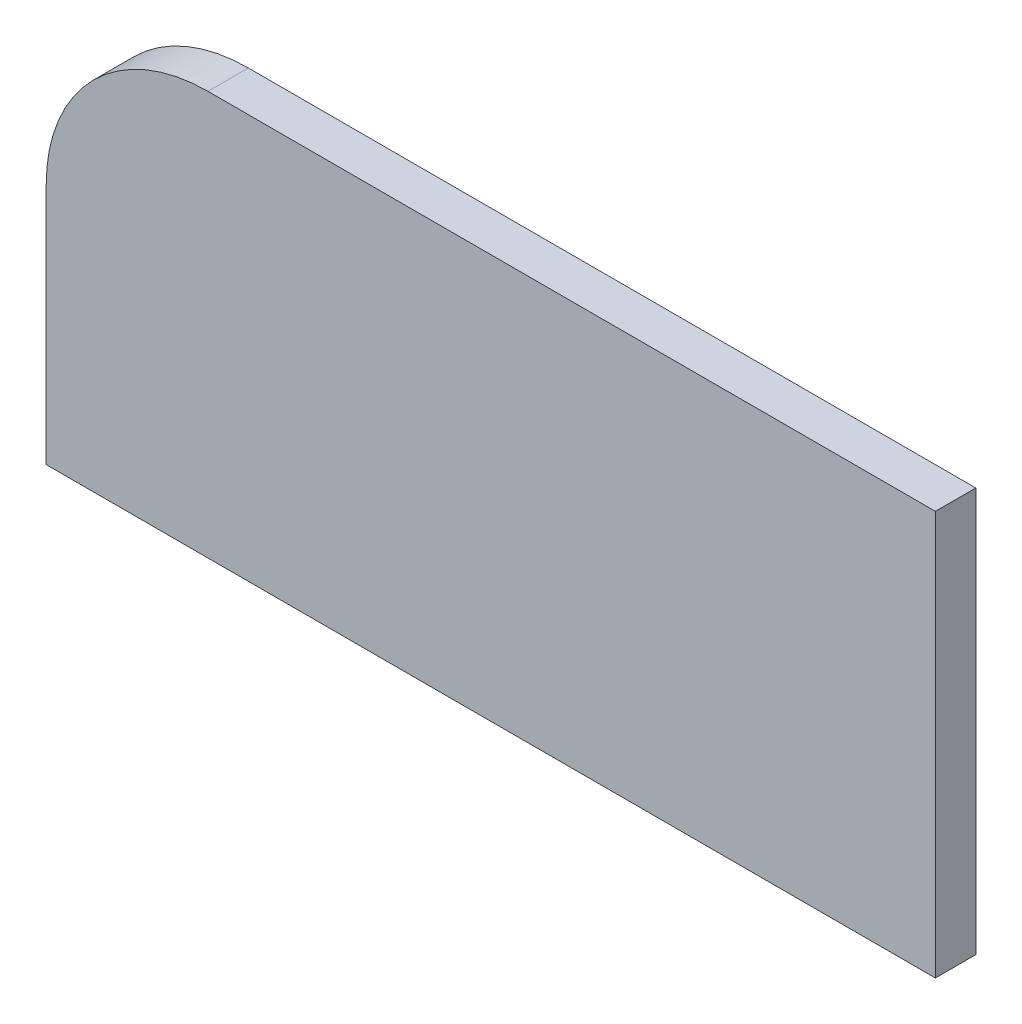
ISO-10303-21;
HEADER;
FILE_DESCRIPTION(('STEP AP214'),'2;1');
FILE_NAME('part.step','',(''),(''),'','','');
FILE_SCHEMA(('AUTOMOTIVE_DESIGN { 1 0 10303 214 1 1 1 1 }'));
ENDSEC;
DATA;
#1=APPLICATION_CONTEXT('core data for automotive mechanical design processes');
#2=APPLICATION_PROTOCOL_DEFINITION('international standard','automotive_design',2000,#1);
#3=PRODUCT_CONTEXT('',#1,'mechanical');
#4=PRODUCT('Part','Part','',(#3));
#5=PRODUCT_RELATED_PRODUCT_CATEGORY('part','',(#4));
#6=PRODUCT_DEFINITION_FORMATION('','',#4);
#7=PRODUCT_DEFINITION_CONTEXT('part definition',#1,'design');
#8=PRODUCT_DEFINITION('design','',#6,#7);
#9=PRODUCT_DEFINITION_SHAPE('','',#8);
#10=(LENGTH_UNIT() NAMED_UNIT(*) SI_UNIT(.MILLI.,.METRE.));
#11=(NAMED_UNIT(*) PLANE_ANGLE_UNIT() SI_UNIT($,.RADIAN.));
#12=(NAMED_UNIT(*) SI_UNIT($,.STERADIAN.) SOLID_ANGLE_UNIT());
#13=UNCERTAINTY_MEASURE_WITH_UNIT(LENGTH_MEASURE(1.E-05),#10,'distance_accuracy_value','');
#14=(GEOMETRIC_REPRESENTATION_CONTEXT(3) GLOBAL_UNCERTAINTY_ASSIGNED_CONTEXT((#13)) GLOBAL_UNIT_ASSIGNED_CONTEXT((#10,
#11,#12)) REPRESENTATION_CONTEXT('',''));
#15=CARTESIAN_POINT('',(0.,0.,0.));
#16=DIRECTION('',(0.,0.,1.));
#17=DIRECTION('',(1.,0.,0.));
#18=AXIS2_PLACEMENT_3D('',#15,#16,#17);
#19=CARTESIAN_POINT('',(0.,0.,5.));
#20=DIRECTION('',(1.,0.,0.));
#21=DIRECTION('',(0.,0.,-1.));
#22=AXIS2_PLACEMENT_3D('',#19,#20,#21);
#23=PLANE('',#22);
#24=DIRECTION('',(0.,-1.,0.));
#25=VECTOR('',#24,1.);
#26=CARTESIAN_POINT('',(0.,0.,5.));
#27=LINE('',#26,#25);
#28=CARTESIAN_POINT('',(0.,30.,5.));
#29=VERTEX_POINT('',#28);
#30=CARTESIAN_POINT('',(0.,0.,5.));
#31=VERTEX_POINT('',#30);
#32=EDGE_CURVE('E77',#29,#31,#27,.T.);
#33=ORIENTED_EDGE('',*,*,#32,.F.);
#34=DIRECTION('',(0.,0.,-1.));
#35=VECTOR('',#34,1.);
#36=CARTESIAN_POINT('',(0.,30.,5.));
#37=LINE('',#36,#35);
#38=CARTESIAN_POINT('',(0.,30.,0.));
#39=VERTEX_POINT('',#38);
#40=EDGE_CURVE('E100',#29,#39,#37,.T.);
#41=ORIENTED_EDGE('',*,*,#40,.T.);
#42=DIRECTION('',(0.,-1.,0.));
#43=VECTOR('',#42,1.);
#44=CARTESIAN_POINT('',(0.,0.,0.));
#45=LINE('',#44,#43);
#46=CARTESIAN_POINT('',(0.,0.,0.));
#47=VERTEX_POINT('',#46);
#48=EDGE_CURVE('E98',#39,#47,#45,.T.);
#49=ORIENTED_EDGE('',*,*,#48,.T.);
#50=DIRECTION('',(0.,0.,-1.));
#51=VECTOR('',#50,1.);
#52=CARTESIAN_POINT('',(0.,0.,5.));
#53=LINE('',#52,#51);
#54=EDGE_CURVE('E92',#31,#47,#53,.T.);
#55=ORIENTED_EDGE('',*,*,#54,.F.);
#56=EDGE_LOOP('',(#33,#41,#49,#55));
#57=FACE_BOUND('',#56,.T.);
#58=ADVANCED_FACE('F31',(#57),#23,.F.);
#59=CARTESIAN_POINT('',(0.,0.,5.));
#60=DIRECTION('',(0.,1.,0.));
#61=DIRECTION('',(0.,0.,1.));
#62=AXIS2_PLACEMENT_3D('',#59,#60,#61);
#63=PLANE('',#62);
#64=DIRECTION('',(1.,0.,0.));
#65=VECTOR('',#64,1.);
#66=CARTESIAN_POINT('',(0.,0.,0.));
#67=LINE('',#66,#65);
#68=CARTESIAN_POINT('',(110.,0.,0.));
#69=VERTEX_POINT('',#68);
#70=EDGE_CURVE('E113',#47,#69,#67,.T.);
#71=ORIENTED_EDGE('',*,*,#70,.T.);
#72=DIRECTION('',(0.,0.,-1.));
#73=VECTOR('',#72,1.);
#74=CARTESIAN_POINT('',(110.,0.,5.));
#75=LINE('',#74,#73);
#76=CARTESIAN_POINT('',(110.,0.,5.));
#77=VERTEX_POINT('',#76);
#78=EDGE_CURVE('E94',#77,#69,#75,.T.);
#79=ORIENTED_EDGE('',*,*,#78,.F.);
#80=DIRECTION('',(1.,0.,0.));
#81=VECTOR('',#80,1.);
#82=CARTESIAN_POINT('',(0.,0.,5.));
#83=LINE('',#82,#81);
#84=EDGE_CURVE('E80',#31,#77,#83,.T.);
#85=ORIENTED_EDGE('',*,*,#84,.F.);
#86=ORIENTED_EDGE('',*,*,#54,.T.);
#87=EDGE_LOOP('',(#71,#79,#85,#86));
#88=FACE_BOUND('',#87,.T.);
#89=ADVANCED_FACE('F91',(#88),#63,.F.);
#90=CARTESIAN_POINT('',(110.,0.,5.));
#91=DIRECTION('',(-1.,0.,0.));
#92=DIRECTION('',(0.,0.,1.));
#93=AXIS2_PLACEMENT_3D('',#90,#91,#92);
#94=PLANE('',#93);
#95=DIRECTION('',(0.,1.,0.));
#96=VECTOR('',#95,1.);
#97=CARTESIAN_POINT('',(110.,0.,0.));
#98=LINE('',#97,#96);
#99=CARTESIAN_POINT('',(110.,50.,0.));
#100=VERTEX_POINT('',#99);
#101=EDGE_CURVE('E111',#69,#100,#98,.T.);
#102=ORIENTED_EDGE('',*,*,#101,.T.);
#103=DIRECTION('',(0.,0.,-1.));
#104=VECTOR('',#103,1.);
#105=CARTESIAN_POINT('',(110.,50.,5.));
#106=LINE('',#105,#104);
#107=CARTESIAN_POINT('',(110.,50.,5.));
#108=VERTEX_POINT('',#107);
#109=EDGE_CURVE('E103',#108,#100,#106,.T.);
#110=ORIENTED_EDGE('',*,*,#109,.F.);
#111=DIRECTION('',(0.,1.,0.));
#112=VECTOR('',#111,1.);
#113=CARTESIAN_POINT('',(110.,0.,5.));
#114=LINE('',#113,#112);
#115=EDGE_CURVE('E96',#77,#108,#114,.T.);
#116=ORIENTED_EDGE('',*,*,#115,.F.);
#117=ORIENTED_EDGE('',*,*,#78,.T.);
#118=EDGE_LOOP('',(#102,#110,#116,#117));
#119=FACE_BOUND('',#118,.T.);
#120=ADVANCED_FACE('F119',(#119),#94,.F.);
#121=CARTESIAN_POINT('',(0.,50.,5.));
#122=DIRECTION('',(0.,-1.,0.));
#123=DIRECTION('',(0.,0.,-1.));
#124=AXIS2_PLACEMENT_3D('',#121,#122,#123);
#125=PLANE('',#124);
#126=DIRECTION('',(-1.,0.,0.));
#127=VECTOR('',#126,1.);
#128=CARTESIAN_POINT('',(0.,50.,0.));
#129=LINE('',#128,#127);
#130=CARTESIAN_POINT('',(20.,50.,0.));
#131=VERTEX_POINT('',#130);
#132=EDGE_CURVE('E87',#100,#131,#129,.T.);
#133=ORIENTED_EDGE('',*,*,#132,.T.);
#134=DIRECTION('',(0.,0.,-1.));
#135=VECTOR('',#134,1.);
#136=CARTESIAN_POINT('',(20.,50.,5.));
#137=LINE('',#136,#135);
#138=CARTESIAN_POINT('',(20.,50.,5.));
#139=VERTEX_POINT('',#138);
#140=EDGE_CURVE('E39',#131,#139,#137,.F.);
#141=ORIENTED_EDGE('',*,*,#140,.T.);
#142=DIRECTION('',(-1.,0.,0.));
#143=VECTOR('',#142,1.);
#144=CARTESIAN_POINT('',(0.,50.,5.));
#145=LINE('',#144,#143);
#146=EDGE_CURVE('E109',#108,#139,#145,.T.);
#147=ORIENTED_EDGE('',*,*,#146,.F.);
#148=ORIENTED_EDGE('',*,*,#109,.T.);
#149=EDGE_LOOP('',(#133,#141,#147,#148));
#150=FACE_BOUND('',#149,.T.);
#151=ADVANCED_FACE('F121',(#150),#125,.F.);
#152=CARTESIAN_POINT('',(0.,50.,5.));
#153=DIRECTION('',(0.,0.,-1.));
#154=DIRECTION('',(-1.,0.,0.));
#155=AXIS2_PLACEMENT_3D('',#152,#153,#154);
#156=PLANE('',#155);
#157=ORIENTED_EDGE('',*,*,#146,.T.);
#158=CARTESIAN_POINT('',(20.,30.,5.));
#159=DIRECTION('',(0.,0.,-1.));
#160=DIRECTION('',(-1.,0.,0.));
#161=AXIS2_PLACEMENT_3D('',#158,#159,#160);
#162=CIRCLE('',#161,20.);
#163=EDGE_CURVE('E11',#139,#29,#162,.F.);
#164=ORIENTED_EDGE('',*,*,#163,.T.);
#165=ORIENTED_EDGE('',*,*,#32,.T.);
#166=ORIENTED_EDGE('',*,*,#84,.T.);
#167=ORIENTED_EDGE('',*,*,#115,.T.);
#168=EDGE_LOOP('',(#157,#164,#165,#166,#167));
#169=FACE_BOUND('',#168,.T.);
#170=ADVANCED_FACE('F79',(#169),#156,.F.);
#171=CARTESIAN_POINT('',(0.,50.,0.));
#172=DIRECTION('',(0.,0.,-1.));
#173=DIRECTION('',(-1.,0.,0.));
#174=AXIS2_PLACEMENT_3D('',#171,#172,#173);
#175=PLANE('',#174);
#176=ORIENTED_EDGE('',*,*,#48,.F.);
#177=CARTESIAN_POINT('',(20.,30.,0.));
#178=DIRECTION('',(0.,0.,-1.));
#179=DIRECTION('',(-1.,0.,0.));
#180=AXIS2_PLACEMENT_3D('',#177,#178,#179);
#181=CIRCLE('',#180,20.);
#182=EDGE_CURVE('E53',#39,#131,#181,.T.);
#183=ORIENTED_EDGE('',*,*,#182,.T.);
#184=ORIENTED_EDGE('',*,*,#132,.F.);
#185=ORIENTED_EDGE('',*,*,#101,.F.);
#186=ORIENTED_EDGE('',*,*,#70,.F.);
#187=EDGE_LOOP('',(#176,#183,#184,#185,#186));
#188=FACE_BOUND('',#187,.T.);
#189=ADVANCED_FACE('F128',(#188),#175,.T.);
#190=CARTESIAN_POINT('',(20.,30.,5.));
#191=DIRECTION('',(0.,0.,-1.));
#192=DIRECTION('',(-1.,0.,0.));
#193=AXIS2_PLACEMENT_3D('',#190,#191,#192);
#194=CYLINDRICAL_SURFACE('',#193,20.);
#195=ORIENTED_EDGE('',*,*,#163,.F.);
#196=ORIENTED_EDGE('',*,*,#140,.F.);
#197=ORIENTED_EDGE('',*,*,#182,.F.);
#198=ORIENTED_EDGE('',*,*,#40,.F.);
#199=EDGE_LOOP('',(#195,#196,#197,#198));
#200=FACE_BOUND('',#199,.T.);
#201=ADVANCED_FACE('F33',(#200),#194,.T.);
#202=CLOSED_SHELL('',(#58,#89,#120,#151,#170,#189,#201));
#203=MANIFOLD_SOLID_BREP('B2',#202);
#204=ADVANCED_BREP_SHAPE_REPRESENTATION('',(#18,#203),#14);
#205=SHAPE_DEFINITION_REPRESENTATION(#9,#204);
ENDSEC;
END-ISO-10303-21;
